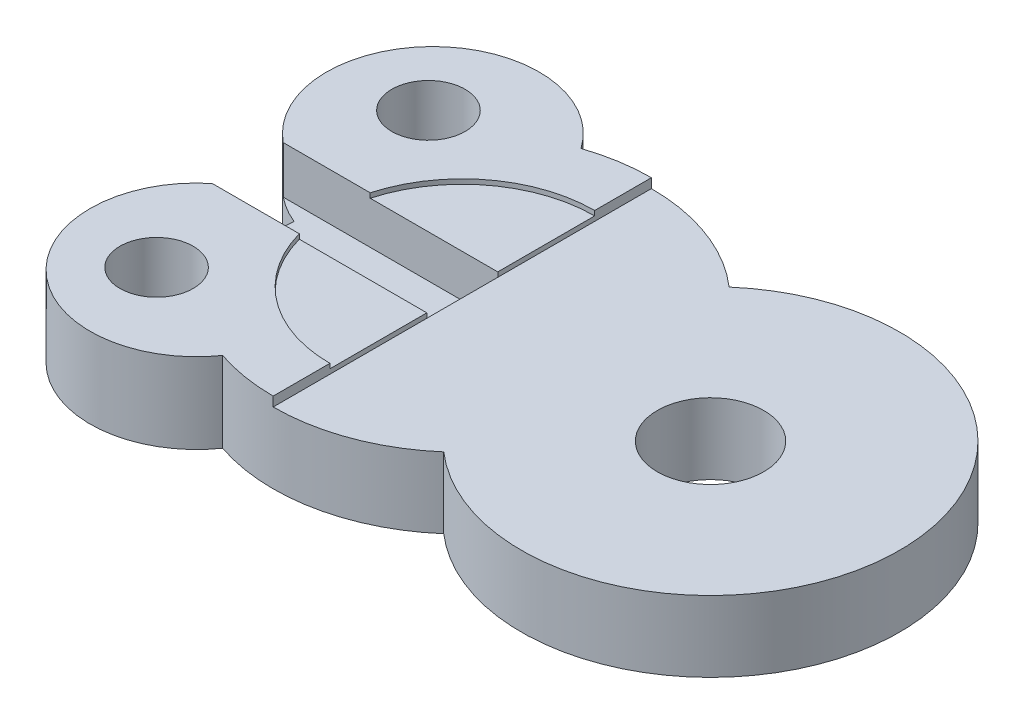
ISO-10303-21;
HEADER;
FILE_DESCRIPTION(('STEP AP214'),'2;1');
FILE_NAME('part.step','',(''),(''),'','','');
FILE_SCHEMA(('AUTOMOTIVE_DESIGN { 1 0 10303 214 1 1 1 1 }'));
ENDSEC;
DATA;
#1=APPLICATION_CONTEXT('core data for automotive mechanical design processes');
#2=APPLICATION_PROTOCOL_DEFINITION('international standard','automotive_design',2000,#1);
#3=PRODUCT_CONTEXT('',#1,'mechanical');
#4=PRODUCT('Part','Part','',(#3));
#5=PRODUCT_RELATED_PRODUCT_CATEGORY('part','',(#4));
#6=PRODUCT_DEFINITION_FORMATION('','',#4);
#7=PRODUCT_DEFINITION_CONTEXT('part definition',#1,'design');
#8=PRODUCT_DEFINITION('design','',#6,#7);
#9=PRODUCT_DEFINITION_SHAPE('','',#8);
#10=(LENGTH_UNIT() NAMED_UNIT(*) SI_UNIT(.MILLI.,.METRE.));
#11=(NAMED_UNIT(*) PLANE_ANGLE_UNIT() SI_UNIT($,.RADIAN.));
#12=(NAMED_UNIT(*) SI_UNIT($,.STERADIAN.) SOLID_ANGLE_UNIT());
#13=UNCERTAINTY_MEASURE_WITH_UNIT(LENGTH_MEASURE(1.E-05),#10,'distance_accuracy_value','');
#14=(GEOMETRIC_REPRESENTATION_CONTEXT(3) GLOBAL_UNCERTAINTY_ASSIGNED_CONTEXT((#13)) GLOBAL_UNIT_ASSIGNED_CONTEXT((#10,
#11,#12)) REPRESENTATION_CONTEXT('',''));
#15=CARTESIAN_POINT('',(0.,0.,0.));
#16=DIRECTION('',(0.,0.,1.));
#17=DIRECTION('',(1.,0.,0.));
#18=AXIS2_PLACEMENT_3D('',#15,#16,#17);
#19=CARTESIAN_POINT('',(-10.5,3.4,-8.));
#20=DIRECTION('',(-1.,0.,0.));
#21=DIRECTION('',(0.,0.,1.));
#22=AXIS2_PLACEMENT_3D('',#19,#20,#21);
#23=PLANE('',#22);
#24=DIRECTION('',(0.,0.,-1.));
#25=VECTOR('',#24,1.);
#26=CARTESIAN_POINT('',(-10.5,3.2,-8.));
#27=LINE('',#26,#25);
#28=CARTESIAN_POINT('',(-10.4999999999999,3.2,5.6));
#29=VERTEX_POINT('',#28);
#30=CARTESIAN_POINT('',(-10.4999999999999,3.2,1.50000000000001));
#31=VERTEX_POINT('',#30);
#32=EDGE_CURVE('E50',#29,#31,#27,.T.);
#33=ORIENTED_EDGE('',*,*,#32,.F.);
#34=DIRECTION('',(0.,1.,0.));
#35=VECTOR('',#34,1.);
#36=CARTESIAN_POINT('',(-10.4999999999999,3.2,5.6));
#37=LINE('',#36,#35);
#38=CARTESIAN_POINT('',(-10.4999999999999,3.4,5.6));
#39=VERTEX_POINT('',#38);
#40=EDGE_CURVE('E158',#29,#39,#37,.T.);
#41=ORIENTED_EDGE('',*,*,#40,.T.);
#42=DIRECTION('',(0.,0.,-1.));
#43=VECTOR('',#42,1.);
#44=CARTESIAN_POINT('',(-10.5,3.4,-8.));
#45=LINE('',#44,#43);
#46=CARTESIAN_POINT('',(-10.4999999999999,3.4,8.));
#47=VERTEX_POINT('',#46);
#48=EDGE_CURVE('E171',#47,#39,#45,.T.);
#49=ORIENTED_EDGE('',*,*,#48,.F.);
#50=DIRECTION('',(0.,-1.,0.));
#51=VECTOR('',#50,1.);
#52=CARTESIAN_POINT('',(-10.4999999999999,3.4,8.));
#53=LINE('',#52,#51);
#54=CARTESIAN_POINT('',(-10.4999999999999,3.,8.));
#55=VERTEX_POINT('',#54);
#56=EDGE_CURVE('E184',#47,#55,#53,.T.);
#57=ORIENTED_EDGE('',*,*,#56,.T.);
#58=DIRECTION('',(0.,0.,-1.));
#59=VECTOR('',#58,1.);
#60=CARTESIAN_POINT('',(-10.5,3.,-8.));
#61=LINE('',#60,#59);
#62=CARTESIAN_POINT('',(-10.4999999999999,3.,1.50000000000001));
#63=VERTEX_POINT('',#62);
#64=EDGE_CURVE('E189',#55,#63,#61,.T.);
#65=ORIENTED_EDGE('',*,*,#64,.T.);
#66=DIRECTION('',(0.,1.,0.));
#67=VECTOR('',#66,1.);
#68=CARTESIAN_POINT('',(-10.4999999999999,1.4,1.50000000000001));
#69=LINE('',#68,#67);
#70=EDGE_CURVE('E264',#63,#31,#69,.T.);
#71=ORIENTED_EDGE('',*,*,#70,.T.);
#72=EDGE_LOOP('',(#33,#41,#49,#57,#65,#71));
#73=FACE_BOUND('',#72,.T.);
#74=ADVANCED_FACE('F35',(#73),#23,.F.);
#75=CARTESIAN_POINT('',(-10.5,3.4,0.));
#76=DIRECTION('',(0.,1.,0.));
#77=DIRECTION('',(0.,0.,1.));
#78=AXIS2_PLACEMENT_3D('',#75,#76,#77);
#79=PLANE('',#78);
#80=CARTESIAN_POINT('',(-17.6817476981582,3.4,5.75));
#81=DIRECTION('',(0.,1.,0.));
#82=DIRECTION('',(0.,0.,1.));
#83=AXIS2_PLACEMENT_3D('',#80,#81,#82);
#84=CIRCLE('',#83,1.55);
#85=CARTESIAN_POINT('',(-17.6817476981582,3.4,7.3));
#86=VERTEX_POINT('',#85);
#87=EDGE_CURVE('E560',#86,#86,#84,.T.);
#88=ORIENTED_EDGE('',*,*,#87,.F.);
#89=EDGE_LOOP('',(#88));
#90=FACE_BOUND('',#89,.T.);
#91=CARTESIAN_POINT('',(-10.5,3.4,0.));
#92=DIRECTION('',(0.,1.,0.));
#93=DIRECTION('',(0.,0.,1.));
#94=AXIS2_PLACEMENT_3D('',#91,#92,#93);
#95=CIRCLE('',#94,5.6);
#96=CARTESIAN_POINT('',(-15.8953683840865,3.4,1.50000000000001));
#97=VERTEX_POINT('',#96);
#98=EDGE_CURVE('E154',#97,#39,#95,.T.);
#99=ORIENTED_EDGE('',*,*,#98,.F.);
#100=DIRECTION('',(1.,0.,0.));
#101=VECTOR('',#100,1.);
#102=CARTESIAN_POINT('',(-10.5,3.4,1.50000000000001));
#103=LINE('',#102,#101);
#104=CARTESIAN_POINT('',(-19.5734251231446,3.4,1.5));
#105=VERTEX_POINT('',#104);
#106=EDGE_CURVE('E239',#105,#97,#103,.T.);
#107=ORIENTED_EDGE('',*,*,#106,.F.);
#108=CARTESIAN_POINT('',(-16.7449979983984,3.4,5.));
#109=DIRECTION('',(0.,1.,0.));
#110=DIRECTION('',(0.,0.,1.));
#111=AXIS2_PLACEMENT_3D('',#108,#109,#110);
#112=CIRCLE('',#111,4.5);
#113=CARTESIAN_POINT('',(-13.0580476745296,3.4,7.57999947855102));
#114=VERTEX_POINT('',#113);
#115=EDGE_CURVE('E289',#105,#114,#112,.T.);
#116=ORIENTED_EDGE('',*,*,#115,.T.);
#117=CARTESIAN_POINT('',(-10.5,3.4,0.));
#118=DIRECTION('',(0.,1.,0.));
#119=DIRECTION('',(0.,0.,1.));
#120=AXIS2_PLACEMENT_3D('',#117,#118,#119);
#121=CIRCLE('',#120,8.);
#122=EDGE_CURVE('E178',#114,#47,#121,.T.);
#123=ORIENTED_EDGE('',*,*,#122,.T.);
#124=ORIENTED_EDGE('',*,*,#48,.T.);
#125=EDGE_LOOP('',(#99,#107,#116,#123,#124));
#126=FACE_BOUND('',#125,.T.);
#127=ADVANCED_FACE('F176',(#90,#126),#79,.T.);
#128=CARTESIAN_POINT('',(-5.25,3.,0.));
#129=DIRECTION('',(0.,1.,0.));
#130=DIRECTION('',(0.,0.,1.));
#131=AXIS2_PLACEMENT_3D('',#128,#129,#130);
#132=PLANE('',#131);
#133=ORIENTED_EDGE('',*,*,#64,.F.);
#134=CARTESIAN_POINT('',(-10.5,3.,0.));
#135=DIRECTION('',(0.,1.,0.));
#136=DIRECTION('',(0.,0.,1.));
#137=AXIS2_PLACEMENT_3D('',#134,#135,#136);
#138=CIRCLE('',#137,8.);
#139=CARTESIAN_POINT('',(-5.25,3.,6.03634823382481));
#140=VERTEX_POINT('',#139);
#141=EDGE_CURVE('E202',#55,#140,#138,.T.);
#142=ORIENTED_EDGE('',*,*,#141,.T.);
#143=CARTESIAN_POINT('',(0.,3.,0.));
#144=DIRECTION('',(0.,1.,0.));
#145=DIRECTION('',(0.,0.,1.));
#146=AXIS2_PLACEMENT_3D('',#143,#144,#145);
#147=CIRCLE('',#146,8.);
#148=CARTESIAN_POINT('',(-5.25,3.,-6.03634823382482));
#149=VERTEX_POINT('',#148);
#150=EDGE_CURVE('E204',#140,#149,#147,.T.);
#151=ORIENTED_EDGE('',*,*,#150,.T.);
#152=CARTESIAN_POINT('',(-10.5,3.,0.));
#153=DIRECTION('',(0.,1.,0.));
#154=DIRECTION('',(0.,0.,1.));
#155=AXIS2_PLACEMENT_3D('',#152,#153,#154);
#156=CIRCLE('',#155,8.);
#157=CARTESIAN_POINT('',(-10.5,3.,-8.));
#158=VERTEX_POINT('',#157);
#159=EDGE_CURVE('E207',#149,#158,#156,.T.);
#160=ORIENTED_EDGE('',*,*,#159,.T.);
#161=CARTESIAN_POINT('',(-10.4999999999999,3.,-1.49999999999999));
#162=VERTEX_POINT('',#161);
#163=EDGE_CURVE('E192',#162,#158,#61,.T.);
#164=ORIENTED_EDGE('',*,*,#163,.F.);
#165=DIRECTION('',(0.,0.,-1.));
#166=VECTOR('',#165,1.);
#167=CARTESIAN_POINT('',(-10.4999999999999,3.,0.));
#168=LINE('',#167,#166);
#169=EDGE_CURVE('E277',#63,#162,#168,.T.);
#170=ORIENTED_EDGE('',*,*,#169,.F.);
#171=EDGE_LOOP('',(#133,#142,#151,#160,#164,#170));
#172=FACE_BOUND('',#171,.T.);
#173=CARTESIAN_POINT('',(0.,3.,0.));
#174=DIRECTION('',(0.,1.,0.));
#175=DIRECTION('',(0.,0.,1.));
#176=AXIS2_PLACEMENT_3D('',#173,#174,#175);
#177=CIRCLE('',#176,2.25);
#178=CARTESIAN_POINT('',(0.,3.,2.25));
#179=VERTEX_POINT('',#178);
#180=EDGE_CURVE('E196',#179,#179,#177,.T.);
#181=ORIENTED_EDGE('',*,*,#180,.F.);
#182=EDGE_LOOP('',(#181));
#183=FACE_BOUND('',#182,.T.);
#184=ADVANCED_FACE('F301',(#172,#183),#132,.T.);
#185=CARTESIAN_POINT('',(-5.25,0.,0.));
#186=DIRECTION('',(0.,1.,0.));
#187=DIRECTION('',(0.,0.,1.));
#188=AXIS2_PLACEMENT_3D('',#185,#186,#187);
#189=PLANE('',#188);
#190=CARTESIAN_POINT('',(-17.6817476981582,0.,-5.75));
#191=DIRECTION('',(0.,1.,0.));
#192=DIRECTION('',(0.,0.,1.));
#193=AXIS2_PLACEMENT_3D('',#190,#191,#192);
#194=CIRCLE('',#193,1.55);
#195=CARTESIAN_POINT('',(-17.6817476981582,0.,-4.2));
#196=VERTEX_POINT('',#195);
#197=EDGE_CURVE('E166',#196,#196,#194,.T.);
#198=ORIENTED_EDGE('',*,*,#197,.T.);
#199=EDGE_LOOP('',(#198));
#200=FACE_BOUND('',#199,.T.);
#201=CARTESIAN_POINT('',(-17.6817476981582,0.,5.75));
#202=DIRECTION('',(0.,1.,0.));
#203=DIRECTION('',(0.,0.,1.));
#204=AXIS2_PLACEMENT_3D('',#201,#202,#203);
#205=CIRCLE('',#204,1.55);
#206=CARTESIAN_POINT('',(-17.6817476981582,0.,7.3));
#207=VERTEX_POINT('',#206);
#208=EDGE_CURVE('E557',#207,#207,#205,.T.);
#209=ORIENTED_EDGE('',*,*,#208,.T.);
#210=EDGE_LOOP('',(#209));
#211=FACE_BOUND('',#210,.T.);
#212=CARTESIAN_POINT('',(-10.5,0.,0.));
#213=DIRECTION('',(0.,1.,0.));
#214=DIRECTION('',(0.,0.,1.));
#215=AXIS2_PLACEMENT_3D('',#212,#213,#214);
#216=CIRCLE('',#215,8.);
#217=CARTESIAN_POINT('',(-13.0580476745296,0.,7.57999947855103));
#218=VERTEX_POINT('',#217);
#219=CARTESIAN_POINT('',(-5.25,0.,6.03634823382481));
#220=VERTEX_POINT('',#219);
#221=EDGE_CURVE('E199',#218,#220,#216,.T.);
#222=ORIENTED_EDGE('',*,*,#221,.F.);
#223=CARTESIAN_POINT('',(-16.7449979983984,0.,5.));
#224=DIRECTION('',(0.,1.,0.));
#225=DIRECTION('',(0.,0.,1.));
#226=AXIS2_PLACEMENT_3D('',#223,#224,#225);
#227=CIRCLE('',#226,4.5);
#228=CARTESIAN_POINT('',(-18.4559919243365,0.,0.837969271448973));
#229=VERTEX_POINT('',#228);
#230=EDGE_CURVE('E205',#229,#218,#227,.T.);
#231=ORIENTED_EDGE('',*,*,#230,.F.);
#232=CARTESIAN_POINT('',(-10.5,0.,0.));
#233=DIRECTION('',(0.,1.,0.));
#234=DIRECTION('',(0.,0.,1.));
#235=AXIS2_PLACEMENT_3D('',#232,#233,#234);
#236=CIRCLE('',#235,8.);
#237=CARTESIAN_POINT('',(-18.4559919243365,0.,-0.837969271448971));
#238=VERTEX_POINT('',#237);
#239=EDGE_CURVE('E220',#238,#229,#236,.T.);
#240=ORIENTED_EDGE('',*,*,#239,.F.);
#241=CARTESIAN_POINT('',(-16.7449979983984,0.,-5.));
#242=DIRECTION('',(0.,1.,0.));
#243=DIRECTION('',(0.,0.,1.));
#244=AXIS2_PLACEMENT_3D('',#241,#242,#243);
#245=CIRCLE('',#244,4.5);
#246=CARTESIAN_POINT('',(-13.0580476745296,0.,-7.57999947855103));
#247=VERTEX_POINT('',#246);
#248=EDGE_CURVE('E217',#247,#238,#245,.T.);
#249=ORIENTED_EDGE('',*,*,#248,.F.);
#250=CARTESIAN_POINT('',(-10.5,0.,0.));
#251=DIRECTION('',(0.,1.,0.));
#252=DIRECTION('',(0.,0.,1.));
#253=AXIS2_PLACEMENT_3D('',#250,#251,#252);
#254=CIRCLE('',#253,8.);
#255=CARTESIAN_POINT('',(-5.25,0.,-6.03634823382482));
#256=VERTEX_POINT('',#255);
#257=EDGE_CURVE('E215',#256,#247,#254,.T.);
#258=ORIENTED_EDGE('',*,*,#257,.F.);
#259=CARTESIAN_POINT('',(0.,0.,0.));
#260=DIRECTION('',(0.,1.,0.));
#261=DIRECTION('',(0.,0.,1.));
#262=AXIS2_PLACEMENT_3D('',#259,#260,#261);
#263=CIRCLE('',#262,8.);
#264=EDGE_CURVE('E213',#220,#256,#263,.T.);
#265=ORIENTED_EDGE('',*,*,#264,.F.);
#266=EDGE_LOOP('',(#222,#231,#240,#249,#258,#265));
#267=FACE_BOUND('',#266,.T.);
#268=CARTESIAN_POINT('',(0.,0.,0.));
#269=DIRECTION('',(0.,1.,0.));
#270=DIRECTION('',(0.,0.,1.));
#271=AXIS2_PLACEMENT_3D('',#268,#269,#270);
#272=CIRCLE('',#271,2.25);
#273=CARTESIAN_POINT('',(0.,0.,2.25));
#274=VERTEX_POINT('',#273);
#275=EDGE_CURVE('E195',#274,#274,#272,.T.);
#276=ORIENTED_EDGE('',*,*,#275,.T.);
#277=EDGE_LOOP('',(#276));
#278=FACE_BOUND('',#277,.T.);
#279=ADVANCED_FACE('F338',(#200,#211,#267,#278),#189,.F.);
#280=CARTESIAN_POINT('',(-10.5,3.,0.));
#281=DIRECTION('',(0.,-1.,0.));
#282=DIRECTION('',(0.,0.,-1.));
#283=AXIS2_PLACEMENT_3D('',#280,#281,#282);
#284=CYLINDRICAL_SURFACE('',#283,8.);
#285=ORIENTED_EDGE('',*,*,#221,.T.);
#286=DIRECTION('',(0.,-1.,0.));
#287=VECTOR('',#286,1.);
#288=CARTESIAN_POINT('',(-5.25,3.,6.03634823382481));
#289=LINE('',#288,#287);
#290=EDGE_CURVE('E236',#140,#220,#289,.T.);
#291=ORIENTED_EDGE('',*,*,#290,.F.);
#292=ORIENTED_EDGE('',*,*,#141,.F.);
#293=ORIENTED_EDGE('',*,*,#56,.F.);
#294=ORIENTED_EDGE('',*,*,#122,.F.);
#295=DIRECTION('',(0.,-1.,0.));
#296=VECTOR('',#295,1.);
#297=CARTESIAN_POINT('',(-13.0580476745296,3.,7.57999947855103));
#298=LINE('',#297,#296);
#299=EDGE_CURVE('E210',#114,#218,#298,.T.);
#300=ORIENTED_EDGE('',*,*,#299,.T.);
#301=EDGE_LOOP('',(#285,#291,#292,#293,#294,#300));
#302=FACE_BOUND('',#301,.T.);
#303=ADVANCED_FACE('F37',(#302),#284,.T.);
#304=CARTESIAN_POINT('',(0.,3.,0.));
#305=DIRECTION('',(0.,-1.,0.));
#306=DIRECTION('',(0.,0.,-1.));
#307=AXIS2_PLACEMENT_3D('',#304,#305,#306);
#308=CYLINDRICAL_SURFACE('',#307,8.);
#309=ORIENTED_EDGE('',*,*,#264,.T.);
#310=DIRECTION('',(0.,-1.,0.));
#311=VECTOR('',#310,1.);
#312=CARTESIAN_POINT('',(-5.25,3.,-6.03634823382482));
#313=LINE('',#312,#311);
#314=EDGE_CURVE('E233',#149,#256,#313,.T.);
#315=ORIENTED_EDGE('',*,*,#314,.F.);
#316=ORIENTED_EDGE('',*,*,#150,.F.);
#317=ORIENTED_EDGE('',*,*,#290,.T.);
#318=EDGE_LOOP('',(#309,#315,#316,#317));
#319=FACE_BOUND('',#318,.T.);
#320=ADVANCED_FACE('F384',(#319),#308,.T.);
#321=CARTESIAN_POINT('',(-10.5,3.,0.));
#322=DIRECTION('',(0.,-1.,0.));
#323=DIRECTION('',(0.,0.,-1.));
#324=AXIS2_PLACEMENT_3D('',#321,#322,#323);
#325=CYLINDRICAL_SURFACE('',#324,8.);
#326=ORIENTED_EDGE('',*,*,#257,.T.);
#327=DIRECTION('',(0.,-1.,0.));
#328=VECTOR('',#327,1.);
#329=CARTESIAN_POINT('',(-13.0580476745296,3.,-7.57999947855103));
#330=LINE('',#329,#328);
#331=CARTESIAN_POINT('',(-13.0580476745296,3.4,-7.57999947855103));
#332=VERTEX_POINT('',#331);
#333=EDGE_CURVE('E230',#332,#247,#330,.T.);
#334=ORIENTED_EDGE('',*,*,#333,.F.);
#335=CARTESIAN_POINT('',(-10.5,3.4,0.));
#336=DIRECTION('',(0.,1.,0.));
#337=DIRECTION('',(0.,0.,1.));
#338=AXIS2_PLACEMENT_3D('',#335,#336,#337);
#339=CIRCLE('',#338,8.);
#340=CARTESIAN_POINT('',(-10.5,3.4,-8.));
#341=VERTEX_POINT('',#340);
#342=EDGE_CURVE('E191',#341,#332,#339,.T.);
#343=ORIENTED_EDGE('',*,*,#342,.F.);
#344=DIRECTION('',(0.,-1.,0.));
#345=VECTOR('',#344,1.);
#346=CARTESIAN_POINT('',(-10.5,3.4,-8.));
#347=LINE('',#346,#345);
#348=EDGE_CURVE('E180',#341,#158,#347,.T.);
#349=ORIENTED_EDGE('',*,*,#348,.T.);
#350=ORIENTED_EDGE('',*,*,#159,.F.);
#351=ORIENTED_EDGE('',*,*,#314,.T.);
#352=EDGE_LOOP('',(#326,#334,#343,#349,#350,#351));
#353=FACE_BOUND('',#352,.T.);
#354=ADVANCED_FACE('F332',(#353),#325,.T.);
#355=CARTESIAN_POINT('',(-16.7449979983984,3.,-5.));
#356=DIRECTION('',(0.,-1.,0.));
#357=DIRECTION('',(0.,0.,-1.));
#358=AXIS2_PLACEMENT_3D('',#355,#356,#357);
#359=CYLINDRICAL_SURFACE('',#358,4.5);
#360=CARTESIAN_POINT('',(-16.7449979983984,1.4,-5.));
#361=DIRECTION('',(0.,-1.,0.));
#362=DIRECTION('',(0.,0.,-1.));
#363=AXIS2_PLACEMENT_3D('',#360,#361,#362);
#364=CIRCLE('',#363,4.5);
#365=CARTESIAN_POINT('',(-18.4559919243365,1.4,-0.837969271448971));
#366=VERTEX_POINT('',#365);
#367=CARTESIAN_POINT('',(-19.5734251231446,1.4,-1.5));
#368=VERTEX_POINT('',#367);
#369=EDGE_CURVE('E282',#366,#368,#364,.T.);
#370=ORIENTED_EDGE('',*,*,#369,.T.);
#371=DIRECTION('',(0.,-1.,0.));
#372=VECTOR('',#371,1.);
#373=CARTESIAN_POINT('',(-19.5734251231446,3.,-1.5));
#374=LINE('',#373,#372);
#375=CARTESIAN_POINT('',(-19.5734251231446,3.4,-1.5));
#376=VERTEX_POINT('',#375);
#377=EDGE_CURVE('E271',#368,#376,#374,.F.);
#378=ORIENTED_EDGE('',*,*,#377,.T.);
#379=CARTESIAN_POINT('',(-16.7449979983984,3.4,-5.));
#380=DIRECTION('',(0.,1.,0.));
#381=DIRECTION('',(0.,0.,1.));
#382=AXIS2_PLACEMENT_3D('',#379,#380,#381);
#383=CIRCLE('',#382,4.5);
#384=EDGE_CURVE('E287',#332,#376,#383,.T.);
#385=ORIENTED_EDGE('',*,*,#384,.F.);
#386=ORIENTED_EDGE('',*,*,#333,.T.);
#387=ORIENTED_EDGE('',*,*,#248,.T.);
#388=DIRECTION('',(0.,-1.,0.));
#389=VECTOR('',#388,1.);
#390=CARTESIAN_POINT('',(-18.4559919243365,3.,-0.837969271448971));
#391=LINE('',#390,#389);
#392=EDGE_CURVE('E228',#366,#238,#391,.T.);
#393=ORIENTED_EDGE('',*,*,#392,.F.);
#394=EDGE_LOOP('',(#370,#378,#385,#386,#387,#393));
#395=FACE_BOUND('',#394,.T.);
#396=ADVANCED_FACE('F326',(#395),#359,.T.);
#397=CARTESIAN_POINT('',(-10.5,3.,0.));
#398=DIRECTION('',(0.,-1.,0.));
#399=DIRECTION('',(0.,0.,-1.));
#400=AXIS2_PLACEMENT_3D('',#397,#398,#399);
#401=CYLINDRICAL_SURFACE('',#400,8.);
#402=DIRECTION('',(0.,-1.,0.));
#403=VECTOR('',#402,1.);
#404=CARTESIAN_POINT('',(-18.4559919243365,3.,0.837969271448973));
#405=LINE('',#404,#403);
#406=CARTESIAN_POINT('',(-18.4559919243365,1.4,0.837969271448973));
#407=VERTEX_POINT('',#406);
#408=EDGE_CURVE('E226',#407,#229,#405,.T.);
#409=ORIENTED_EDGE('',*,*,#408,.F.);
#410=CARTESIAN_POINT('',(-10.5,1.4,0.));
#411=DIRECTION('',(0.,-1.,0.));
#412=DIRECTION('',(0.,0.,-1.));
#413=AXIS2_PLACEMENT_3D('',#410,#411,#412);
#414=CIRCLE('',#413,8.);
#415=EDGE_CURVE('E279',#407,#366,#414,.T.);
#416=ORIENTED_EDGE('',*,*,#415,.T.);
#417=ORIENTED_EDGE('',*,*,#392,.T.);
#418=ORIENTED_EDGE('',*,*,#239,.T.);
#419=EDGE_LOOP('',(#409,#416,#417,#418));
#420=FACE_BOUND('',#419,.T.);
#421=ADVANCED_FACE('F342',(#420),#401,.T.);
#422=CARTESIAN_POINT('',(-16.7449979983984,3.,5.));
#423=DIRECTION('',(0.,-1.,0.));
#424=DIRECTION('',(0.,0.,-1.));
#425=AXIS2_PLACEMENT_3D('',#422,#423,#424);
#426=CYLINDRICAL_SURFACE('',#425,4.5);
#427=ORIENTED_EDGE('',*,*,#115,.F.);
#428=DIRECTION('',(0.,-1.,0.));
#429=VECTOR('',#428,1.);
#430=CARTESIAN_POINT('',(-19.5734251231446,3.,1.5));
#431=LINE('',#430,#429);
#432=CARTESIAN_POINT('',(-19.5734251231446,1.4,1.5));
#433=VERTEX_POINT('',#432);
#434=EDGE_CURVE('E274',#105,#433,#431,.T.);
#435=ORIENTED_EDGE('',*,*,#434,.T.);
#436=CARTESIAN_POINT('',(-16.7449979983984,1.4,5.));
#437=DIRECTION('',(0.,-1.,0.));
#438=DIRECTION('',(0.,0.,-1.));
#439=AXIS2_PLACEMENT_3D('',#436,#437,#438);
#440=CIRCLE('',#439,4.5);
#441=EDGE_CURVE('E241',#433,#407,#440,.T.);
#442=ORIENTED_EDGE('',*,*,#441,.T.);
#443=ORIENTED_EDGE('',*,*,#408,.T.);
#444=ORIENTED_EDGE('',*,*,#230,.T.);
#445=ORIENTED_EDGE('',*,*,#299,.F.);
#446=EDGE_LOOP('',(#427,#435,#442,#443,#444,#445));
#447=FACE_BOUND('',#446,.T.);
#448=ADVANCED_FACE('F293',(#447),#426,.T.);
#449=CARTESIAN_POINT('',(0.,3.,0.));
#450=DIRECTION('',(0.,-1.,0.));
#451=DIRECTION('',(0.,0.,-1.));
#452=AXIS2_PLACEMENT_3D('',#449,#450,#451);
#453=CYLINDRICAL_SURFACE('',#452,2.25);
#454=ORIENTED_EDGE('',*,*,#180,.T.);
#455=EDGE_LOOP('',(#454));
#456=FACE_BOUND('',#455,.T.);
#457=ORIENTED_EDGE('',*,*,#275,.F.);
#458=EDGE_LOOP('',(#457));
#459=FACE_BOUND('',#458,.T.);
#460=ADVANCED_FACE('F363',(#456,#459),#453,.F.);
#461=CARTESIAN_POINT('',(-10.5,3.4,-5.6));
#462=VERTEX_POINT('',#461);
#463=EDGE_CURVE('E181',#462,#341,#45,.T.);
#464=ORIENTED_EDGE('',*,*,#463,.F.);
#465=DIRECTION('',(0.,1.,0.));
#466=VECTOR('',#465,1.);
#467=CARTESIAN_POINT('',(-10.5,3.2,-5.6));
#468=LINE('',#467,#466);
#469=CARTESIAN_POINT('',(-10.5,3.2,-5.6));
#470=VERTEX_POINT('',#469);
#471=EDGE_CURVE('E174',#462,#470,#468,.F.);
#472=ORIENTED_EDGE('',*,*,#471,.T.);
#473=DIRECTION('',(0.,0.,-1.));
#474=VECTOR('',#473,1.);
#475=CARTESIAN_POINT('',(-10.5,3.2,-8.));
#476=LINE('',#475,#474);
#477=CARTESIAN_POINT('',(-10.4999999999999,3.2,-1.49999999999999));
#478=VERTEX_POINT('',#477);
#479=EDGE_CURVE('E246',#478,#470,#476,.T.);
#480=ORIENTED_EDGE('',*,*,#479,.F.);
#481=DIRECTION('',(0.,1.,0.));
#482=VECTOR('',#481,1.);
#483=CARTESIAN_POINT('',(-10.4999999999999,1.4,-1.49999999999999));
#484=LINE('',#483,#482);
#485=EDGE_CURVE('E254',#162,#478,#484,.T.);
#486=ORIENTED_EDGE('',*,*,#485,.F.);
#487=ORIENTED_EDGE('',*,*,#163,.T.);
#488=ORIENTED_EDGE('',*,*,#348,.F.);
#489=EDGE_LOOP('',(#464,#472,#480,#486,#487,#488));
#490=FACE_BOUND('',#489,.T.);
#491=ADVANCED_FACE('F253',(#490),#23,.F.);
#492=CARTESIAN_POINT('',(-17.6817476981582,3.4,-5.75));
#493=DIRECTION('',(0.,1.,0.));
#494=DIRECTION('',(0.,0.,1.));
#495=AXIS2_PLACEMENT_3D('',#492,#493,#494);
#496=CIRCLE('',#495,1.55);
#497=CARTESIAN_POINT('',(-17.6817476981582,3.4,-4.2));
#498=VERTEX_POINT('',#497);
#499=EDGE_CURVE('E562',#498,#498,#496,.T.);
#500=ORIENTED_EDGE('',*,*,#499,.F.);
#501=EDGE_LOOP('',(#500));
#502=FACE_BOUND('',#501,.T.);
#503=CARTESIAN_POINT('',(-15.8953683840865,3.4,-1.5));
#504=VERTEX_POINT('',#503);
#505=EDGE_CURVE('E165',#462,#504,#95,.T.);
#506=ORIENTED_EDGE('',*,*,#505,.F.);
#507=ORIENTED_EDGE('',*,*,#463,.T.);
#508=ORIENTED_EDGE('',*,*,#342,.T.);
#509=ORIENTED_EDGE('',*,*,#384,.T.);
#510=DIRECTION('',(-1.,0.,0.));
#511=VECTOR('',#510,1.);
#512=CARTESIAN_POINT('',(-10.4999999999999,3.4,-1.49999999999999));
#513=LINE('',#512,#511);
#514=EDGE_CURVE('E173',#504,#376,#513,.T.);
#515=ORIENTED_EDGE('',*,*,#514,.F.);
#516=EDGE_LOOP('',(#506,#507,#508,#509,#515));
#517=FACE_BOUND('',#516,.T.);
#518=ADVANCED_FACE('F328',(#502,#517),#79,.T.);
#519=CARTESIAN_POINT('',(0.,1.4,0.));
#520=DIRECTION('',(0.,-1.,0.));
#521=DIRECTION('',(0.,0.,-1.));
#522=AXIS2_PLACEMENT_3D('',#519,#520,#521);
#523=PLANE('',#522);
#524=ORIENTED_EDGE('',*,*,#415,.F.);
#525=ORIENTED_EDGE('',*,*,#441,.F.);
#526=DIRECTION('',(1.,0.,0.));
#527=VECTOR('',#526,1.);
#528=CARTESIAN_POINT('',(-10.4999999999999,1.4,1.50000000000001));
#529=LINE('',#528,#527);
#530=CARTESIAN_POINT('',(-10.4999999999999,1.4,1.50000000000001));
#531=VERTEX_POINT('',#530);
#532=EDGE_CURVE('E262',#433,#531,#529,.T.);
#533=ORIENTED_EDGE('',*,*,#532,.T.);
#534=DIRECTION('',(0.,0.,-1.));
#535=VECTOR('',#534,1.);
#536=CARTESIAN_POINT('',(-10.4999999999999,1.4,-1.49999999999999));
#537=LINE('',#536,#535);
#538=CARTESIAN_POINT('',(-10.4999999999999,1.4,-1.49999999999999));
#539=VERTEX_POINT('',#538);
#540=EDGE_CURVE('E310',#531,#539,#537,.T.);
#541=ORIENTED_EDGE('',*,*,#540,.T.);
#542=DIRECTION('',(-1.,0.,0.));
#543=VECTOR('',#542,1.);
#544=CARTESIAN_POINT('',(-10.4999999999999,1.4,-1.49999999999999));
#545=LINE('',#544,#543);
#546=EDGE_CURVE('E265',#539,#368,#545,.T.);
#547=ORIENTED_EDGE('',*,*,#546,.T.);
#548=ORIENTED_EDGE('',*,*,#369,.F.);
#549=EDGE_LOOP('',(#524,#525,#533,#541,#547,#548));
#550=FACE_BOUND('',#549,.T.);
#551=ADVANCED_FACE('F344',(#550),#523,.F.);
#552=CARTESIAN_POINT('',(-10.4999999999999,1.4,1.50000000000001));
#553=DIRECTION('',(0.,0.,1.));
#554=DIRECTION('',(1.,0.,0.));
#555=AXIS2_PLACEMENT_3D('',#552,#553,#554);
#556=PLANE('',#555);
#557=ORIENTED_EDGE('',*,*,#106,.T.);
#558=DIRECTION('',(0.,1.,0.));
#559=VECTOR('',#558,1.);
#560=CARTESIAN_POINT('',(-15.8953683840865,3.2,1.50000000000001));
#561=LINE('',#560,#559);
#562=CARTESIAN_POINT('',(-15.8953683840865,3.2,1.50000000000001));
#563=VERTEX_POINT('',#562);
#564=EDGE_CURVE('E160',#97,#563,#561,.F.);
#565=ORIENTED_EDGE('',*,*,#564,.T.);
#566=DIRECTION('',(-1.,0.,0.));
#567=VECTOR('',#566,1.);
#568=CARTESIAN_POINT('',(-10.4999999999999,3.2,1.50000000000001));
#569=LINE('',#568,#567);
#570=EDGE_CURVE('E256',#31,#563,#569,.T.);
#571=ORIENTED_EDGE('',*,*,#570,.F.);
#572=ORIENTED_EDGE('',*,*,#70,.F.);
#573=EDGE_CURVE('E269',#531,#63,#69,.T.);
#574=ORIENTED_EDGE('',*,*,#573,.F.);
#575=ORIENTED_EDGE('',*,*,#532,.F.);
#576=ORIENTED_EDGE('',*,*,#434,.F.);
#577=EDGE_LOOP('',(#557,#565,#571,#572,#574,#575,#576));
#578=FACE_BOUND('',#577,.T.);
#579=ADVANCED_FACE('F313',(#578),#556,.F.);
#580=CARTESIAN_POINT('',(-10.4999999999999,1.4,-1.49999999999999));
#581=DIRECTION('',(0.,0.,-1.));
#582=DIRECTION('',(-1.,0.,0.));
#583=AXIS2_PLACEMENT_3D('',#580,#581,#582);
#584=PLANE('',#583);
#585=DIRECTION('',(1.,0.,0.));
#586=VECTOR('',#585,1.);
#587=CARTESIAN_POINT('',(-10.4999999999999,3.2,-1.49999999999999));
#588=LINE('',#587,#586);
#589=CARTESIAN_POINT('',(-15.8953683840865,3.2,-1.5));
#590=VERTEX_POINT('',#589);
#591=EDGE_CURVE('E43',#590,#478,#588,.T.);
#592=ORIENTED_EDGE('',*,*,#591,.F.);
#593=DIRECTION('',(0.,1.,0.));
#594=VECTOR('',#593,1.);
#595=CARTESIAN_POINT('',(-15.8953683840865,3.2,-1.5));
#596=LINE('',#595,#594);
#597=EDGE_CURVE('E11',#590,#504,#596,.T.);
#598=ORIENTED_EDGE('',*,*,#597,.T.);
#599=ORIENTED_EDGE('',*,*,#514,.T.);
#600=ORIENTED_EDGE('',*,*,#377,.F.);
#601=ORIENTED_EDGE('',*,*,#546,.F.);
#602=EDGE_CURVE('E261',#539,#162,#484,.T.);
#603=ORIENTED_EDGE('',*,*,#602,.T.);
#604=ORIENTED_EDGE('',*,*,#485,.T.);
#605=EDGE_LOOP('',(#592,#598,#599,#600,#601,#603,#604));
#606=FACE_BOUND('',#605,.T.);
#607=ADVANCED_FACE('F259',(#606),#584,.F.);
#608=CARTESIAN_POINT('',(-10.4999999999999,1.4,-1.49999999999999));
#609=DIRECTION('',(1.,0.,0.));
#610=DIRECTION('',(0.,0.,-1.));
#611=AXIS2_PLACEMENT_3D('',#608,#609,#610);
#612=PLANE('',#611);
#613=ORIENTED_EDGE('',*,*,#169,.T.);
#614=ORIENTED_EDGE('',*,*,#602,.F.);
#615=ORIENTED_EDGE('',*,*,#540,.F.);
#616=ORIENTED_EDGE('',*,*,#573,.T.);
#617=EDGE_LOOP('',(#613,#614,#615,#616));
#618=FACE_BOUND('',#617,.T.);
#619=ADVANCED_FACE('F306',(#618),#612,.F.);
#620=CARTESIAN_POINT('',(-10.5,3.2,0.));
#621=DIRECTION('',(0.,1.,0.));
#622=DIRECTION('',(0.,0.,1.));
#623=AXIS2_PLACEMENT_3D('',#620,#621,#622);
#624=PLANE('',#623);
#625=ORIENTED_EDGE('',*,*,#479,.T.);
#626=CARTESIAN_POINT('',(-10.5,3.2,0.));
#627=DIRECTION('',(0.,1.,0.));
#628=DIRECTION('',(0.,0.,1.));
#629=AXIS2_PLACEMENT_3D('',#626,#627,#628);
#630=CIRCLE('',#629,5.6);
#631=EDGE_CURVE('E58',#470,#590,#630,.T.);
#632=ORIENTED_EDGE('',*,*,#631,.T.);
#633=ORIENTED_EDGE('',*,*,#591,.T.);
#634=EDGE_LOOP('',(#625,#632,#633));
#635=FACE_BOUND('',#634,.T.);
#636=ADVANCED_FACE('F245',(#635),#624,.T.);
#637=CARTESIAN_POINT('',(-10.5,3.2,0.));
#638=DIRECTION('',(0.,1.,0.));
#639=DIRECTION('',(0.,0.,1.));
#640=AXIS2_PLACEMENT_3D('',#637,#638,#639);
#641=CYLINDRICAL_SURFACE('',#640,5.6);
#642=ORIENTED_EDGE('',*,*,#505,.T.);
#643=ORIENTED_EDGE('',*,*,#597,.F.);
#644=ORIENTED_EDGE('',*,*,#631,.F.);
#645=ORIENTED_EDGE('',*,*,#471,.F.);
#646=EDGE_LOOP('',(#642,#643,#644,#645));
#647=FACE_BOUND('',#646,.T.);
#648=ADVANCED_FACE('F431',(#647),#641,.F.);
#649=EDGE_CURVE('E566',#563,#29,#630,.T.);
#650=ORIENTED_EDGE('',*,*,#649,.F.);
#651=ORIENTED_EDGE('',*,*,#564,.F.);
#652=ORIENTED_EDGE('',*,*,#98,.T.);
#653=ORIENTED_EDGE('',*,*,#40,.F.);
#654=EDGE_LOOP('',(#650,#651,#652,#653));
#655=FACE_BOUND('',#654,.T.);
#656=ADVANCED_FACE('F157',(#655),#641,.F.);
#657=ORIENTED_EDGE('',*,*,#32,.T.);
#658=ORIENTED_EDGE('',*,*,#570,.T.);
#659=ORIENTED_EDGE('',*,*,#649,.T.);
#660=EDGE_LOOP('',(#657,#658,#659));
#661=FACE_BOUND('',#660,.T.);
#662=ADVANCED_FACE('F415',(#661),#624,.T.);
#663=CARTESIAN_POINT('',(-17.6817476981582,0.,-5.75));
#664=DIRECTION('',(0.,1.,0.));
#665=DIRECTION('',(0.,0.,1.));
#666=AXIS2_PLACEMENT_3D('',#663,#664,#665);
#667=CYLINDRICAL_SURFACE('',#666,1.55);
#668=ORIENTED_EDGE('',*,*,#197,.F.);
#669=EDGE_LOOP('',(#668));
#670=FACE_BOUND('',#669,.T.);
#671=ORIENTED_EDGE('',*,*,#499,.T.);
#672=EDGE_LOOP('',(#671));
#673=FACE_BOUND('',#672,.T.);
#674=ADVANCED_FACE('F420',(#670,#673),#667,.F.);
#675=CARTESIAN_POINT('',(-17.6817476981582,0.,5.75));
#676=DIRECTION('',(0.,1.,0.));
#677=DIRECTION('',(0.,0.,1.));
#678=AXIS2_PLACEMENT_3D('',#675,#676,#677);
#679=CYLINDRICAL_SURFACE('',#678,1.55);
#680=ORIENTED_EDGE('',*,*,#208,.F.);
#681=EDGE_LOOP('',(#680));
#682=FACE_BOUND('',#681,.T.);
#683=ORIENTED_EDGE('',*,*,#87,.T.);
#684=EDGE_LOOP('',(#683));
#685=FACE_BOUND('',#684,.T.);
#686=ADVANCED_FACE('F540',(#682,#685),#679,.F.);
#687=CLOSED_SHELL('',(#74,#127,#184,#279,#303,#320,#354,#396,#421,#448,#460,#491,#518,#551,#579,
#607,#619,#636,#648,#656,#662,#674,#686));
#688=MANIFOLD_SOLID_BREP('B2',#687);
#689=ADVANCED_BREP_SHAPE_REPRESENTATION('',(#18,#688),#14);
#690=SHAPE_DEFINITION_REPRESENTATION(#9,#689);
ENDSEC;
END-ISO-10303-21;
